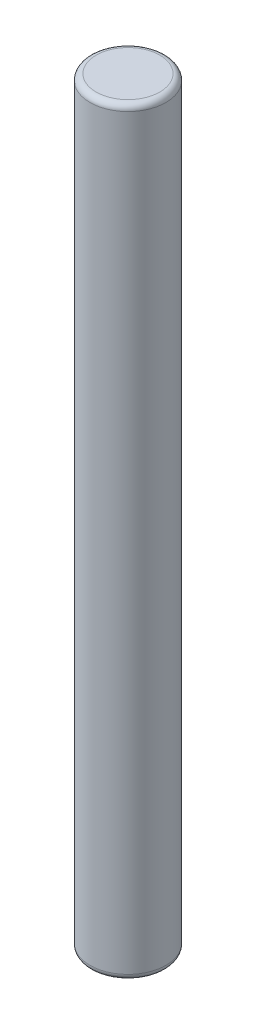
ISO-10303-21;
HEADER;
FILE_DESCRIPTION(('STEP AP214'),'2;1');
FILE_NAME('part.step','',(''),(''),'','','');
FILE_SCHEMA(('AUTOMOTIVE_DESIGN { 1 0 10303 214 1 1 1 1 }'));
ENDSEC;
DATA;
#1=APPLICATION_CONTEXT('core data for automotive mechanical design processes');
#2=APPLICATION_PROTOCOL_DEFINITION('international standard','automotive_design',2000,#1);
#3=PRODUCT_CONTEXT('',#1,'mechanical');
#4=PRODUCT('Part','Part','',(#3));
#5=PRODUCT_RELATED_PRODUCT_CATEGORY('part','',(#4));
#6=PRODUCT_DEFINITION_FORMATION('','',#4);
#7=PRODUCT_DEFINITION_CONTEXT('part definition',#1,'design');
#8=PRODUCT_DEFINITION('design','',#6,#7);
#9=PRODUCT_DEFINITION_SHAPE('','',#8);
#10=(LENGTH_UNIT() NAMED_UNIT(*) SI_UNIT(.MILLI.,.METRE.));
#11=(NAMED_UNIT(*) PLANE_ANGLE_UNIT() SI_UNIT($,.RADIAN.));
#12=(NAMED_UNIT(*) SI_UNIT($,.STERADIAN.) SOLID_ANGLE_UNIT());
#13=UNCERTAINTY_MEASURE_WITH_UNIT(LENGTH_MEASURE(1.E-05),#10,'distance_accuracy_value','');
#14=(GEOMETRIC_REPRESENTATION_CONTEXT(3) GLOBAL_UNCERTAINTY_ASSIGNED_CONTEXT((#13)) GLOBAL_UNIT_ASSIGNED_CONTEXT((#10,
#11,#12)) REPRESENTATION_CONTEXT('',''));
#15=CARTESIAN_POINT('',(0.,0.,0.));
#16=DIRECTION('',(0.,0.,1.));
#17=DIRECTION('',(1.,0.,0.));
#18=AXIS2_PLACEMENT_3D('',#15,#16,#17);
#19=CARTESIAN_POINT('',(0.,31.75,0.));
#20=DIRECTION('',(0.,-1.,0.));
#21=DIRECTION('',(0.,0.,-1.));
#22=AXIS2_PLACEMENT_3D('',#19,#20,#21);
#23=CYLINDRICAL_SURFACE('',#22,1.5875);
#24=CARTESIAN_POINT('',(0.,0.253999999999997,0.));
#25=DIRECTION('',(0.,1.,0.));
#26=DIRECTION('',(0.,0.,1.));
#27=AXIS2_PLACEMENT_3D('',#24,#25,#26);
#28=CIRCLE('',#27,1.5875);
#29=CARTESIAN_POINT('',(0.,0.253999999999997,1.5875));
#30=VERTEX_POINT('',#29);
#31=EDGE_CURVE('E37',#30,#30,#28,.T.);
#32=ORIENTED_EDGE('',*,*,#31,.T.);
#33=EDGE_LOOP('',(#32));
#34=FACE_BOUND('',#33,.T.);
#35=CARTESIAN_POINT('',(0.,31.496,0.));
#36=DIRECTION('',(0.,1.,0.));
#37=DIRECTION('',(0.,0.,1.));
#38=AXIS2_PLACEMENT_3D('',#35,#36,#37);
#39=CIRCLE('',#38,1.5875);
#40=CARTESIAN_POINT('',(0.,31.496,1.5875));
#41=VERTEX_POINT('',#40);
#42=EDGE_CURVE('E41',#41,#41,#39,.F.);
#43=ORIENTED_EDGE('',*,*,#42,.T.);
#44=EDGE_LOOP('',(#43));
#45=FACE_BOUND('',#44,.T.);
#46=ADVANCED_FACE('F30',(#34,#45),#23,.T.);
#47=CARTESIAN_POINT('',(0.,31.75,0.));
#48=DIRECTION('',(0.,1.,0.));
#49=DIRECTION('',(0.,0.,1.));
#50=AXIS2_PLACEMENT_3D('',#47,#48,#49);
#51=PLANE('',#50);
#52=CARTESIAN_POINT('',(0.,31.75,0.));
#53=DIRECTION('',(0.,1.,0.));
#54=DIRECTION('',(0.,0.,1.));
#55=AXIS2_PLACEMENT_3D('',#52,#53,#54);
#56=CIRCLE('',#55,1.3335);
#57=CARTESIAN_POINT('',(0.,31.75,1.3335));
#58=VERTEX_POINT('',#57);
#59=EDGE_CURVE('E45',#58,#58,#56,.T.);
#60=ORIENTED_EDGE('',*,*,#59,.T.);
#61=EDGE_LOOP('',(#60));
#62=FACE_BOUND('',#61,.T.);
#63=ADVANCED_FACE('F51',(#62),#51,.T.);
#64=CARTESIAN_POINT('',(0.,0.,0.));
#65=DIRECTION('',(0.,1.,0.));
#66=DIRECTION('',(0.,0.,1.));
#67=AXIS2_PLACEMENT_3D('',#64,#65,#66);
#68=PLANE('',#67);
#69=CARTESIAN_POINT('',(0.,0.,0.));
#70=DIRECTION('',(0.,1.,0.));
#71=DIRECTION('',(0.,0.,1.));
#72=AXIS2_PLACEMENT_3D('',#69,#70,#71);
#73=CIRCLE('',#72,1.3335);
#74=CARTESIAN_POINT('',(0.,0.,1.3335));
#75=VERTEX_POINT('',#74);
#76=EDGE_CURVE('E10',#75,#75,#73,.F.);
#77=ORIENTED_EDGE('',*,*,#76,.T.);
#78=EDGE_LOOP('',(#77));
#79=FACE_BOUND('',#78,.T.);
#80=ADVANCED_FACE('F55',(#79),#68,.F.);
#81=CARTESIAN_POINT('',(0.,31.496,0.));
#82=DIRECTION('',(0.,1.,0.));
#83=DIRECTION('',(0.,0.,1.));
#84=AXIS2_PLACEMENT_3D('',#81,#82,#83);
#85=TOROIDAL_SURFACE('',#84,1.3335,0.254);
#86=ORIENTED_EDGE('',*,*,#42,.F.);
#87=EDGE_LOOP('',(#86));
#88=FACE_BOUND('',#87,.T.);
#89=ORIENTED_EDGE('',*,*,#59,.F.);
#90=EDGE_LOOP('',(#89));
#91=FACE_BOUND('',#90,.T.);
#92=ADVANCED_FACE('F53',(#88,#91),#85,.T.);
#93=CARTESIAN_POINT('',(0.,0.253999999999997,0.));
#94=DIRECTION('',(0.,1.,0.));
#95=DIRECTION('',(0.,0.,1.));
#96=AXIS2_PLACEMENT_3D('',#93,#94,#95);
#97=TOROIDAL_SURFACE('',#96,1.3335,0.254);
#98=ORIENTED_EDGE('',*,*,#76,.F.);
#99=EDGE_LOOP('',(#98));
#100=FACE_BOUND('',#99,.T.);
#101=ORIENTED_EDGE('',*,*,#31,.F.);
#102=EDGE_LOOP('',(#101));
#103=FACE_BOUND('',#102,.T.);
#104=ADVANCED_FACE('F32',(#100,#103),#97,.T.);
#105=CLOSED_SHELL('',(#46,#63,#80,#92,#104));
#106=MANIFOLD_SOLID_BREP('B2',#105);
#107=ADVANCED_BREP_SHAPE_REPRESENTATION('',(#18,#106),#14);
#108=SHAPE_DEFINITION_REPRESENTATION(#9,#107);
ENDSEC;
END-ISO-10303-21;
